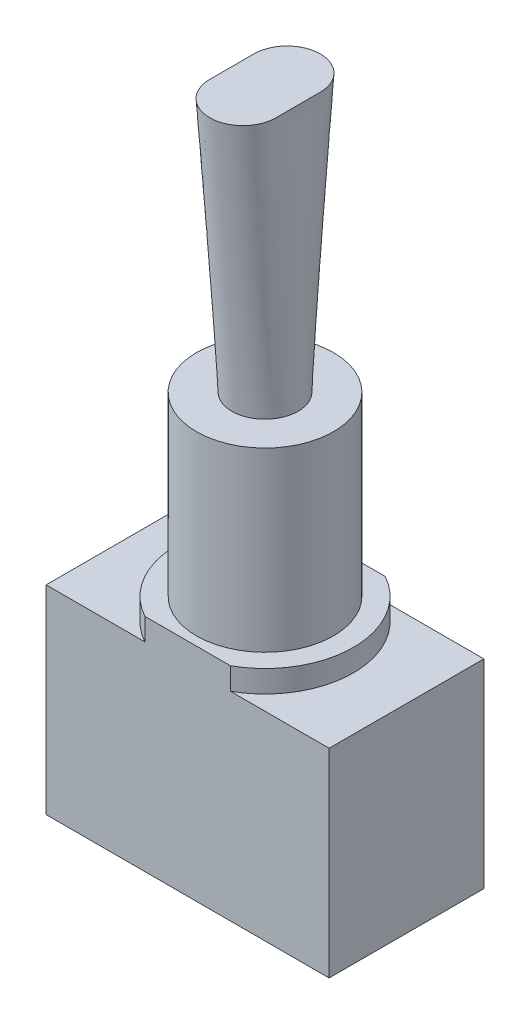
ISO-10303-21;
HEADER;
FILE_DESCRIPTION(('STEP AP214'),'2;1');
FILE_NAME('part.step','',(''),(''),'','','');
FILE_SCHEMA(('AUTOMOTIVE_DESIGN { 1 0 10303 214 1 1 1 1 }'));
ENDSEC;
DATA;
#1=APPLICATION_CONTEXT('core data for automotive mechanical design processes');
#2=APPLICATION_PROTOCOL_DEFINITION('international standard','automotive_design',2000,#1);
#3=PRODUCT_CONTEXT('',#1,'mechanical');
#4=PRODUCT('Part','Part','',(#3));
#5=PRODUCT_RELATED_PRODUCT_CATEGORY('part','',(#4));
#6=PRODUCT_DEFINITION_FORMATION('','',#4);
#7=PRODUCT_DEFINITION_CONTEXT('part definition',#1,'design');
#8=PRODUCT_DEFINITION('design','',#6,#7);
#9=PRODUCT_DEFINITION_SHAPE('','',#8);
#10=(LENGTH_UNIT() NAMED_UNIT(*) SI_UNIT(.MILLI.,.METRE.));
#11=(NAMED_UNIT(*) PLANE_ANGLE_UNIT() SI_UNIT($,.RADIAN.));
#12=(NAMED_UNIT(*) SI_UNIT($,.STERADIAN.) SOLID_ANGLE_UNIT());
#13=UNCERTAINTY_MEASURE_WITH_UNIT(LENGTH_MEASURE(1.E-05),#10,'distance_accuracy_value','');
#14=(GEOMETRIC_REPRESENTATION_CONTEXT(3) GLOBAL_UNCERTAINTY_ASSIGNED_CONTEXT((#13)) GLOBAL_UNIT_ASSIGNED_CONTEXT((#10,
#11,#12)) REPRESENTATION_CONTEXT('',''));
#15=CARTESIAN_POINT('',(0.,0.,0.));
#16=DIRECTION('',(0.,0.,1.));
#17=DIRECTION('',(1.,0.,0.));
#18=AXIS2_PLACEMENT_3D('',#15,#16,#17);
#19=CARTESIAN_POINT('',(0.,9.,0.));
#20=DIRECTION('',(0.,1.,0.));
#21=DIRECTION('',(-1.,0.,0.));
#22=AXIS2_PLACEMENT_3D('',#19,#20,#21);
#23=PLANE('',#22);
#24=CARTESIAN_POINT('',(0.,9.,0.));
#25=DIRECTION('',(0.,1.,0.));
#26=DIRECTION('',(-1.,0.,0.));
#27=AXIS2_PLACEMENT_3D('',#24,#25,#26);
#28=CIRCLE('',#27,3.1);
#29=CARTESIAN_POINT('',(-3.1,9.,0.));
#30=VERTEX_POINT('',#29);
#31=EDGE_CURVE('E277',#30,#30,#28,.T.);
#32=ORIENTED_EDGE('',*,*,#31,.T.);
#33=EDGE_LOOP('',(#32));
#34=FACE_BOUND('',#33,.T.);
#35=CARTESIAN_POINT('',(1.24807544149403,9.,0.832050294356937));
#36=CARTESIAN_POINT('',(1.20133692597067,9.,0.902160729367027));
#37=CARTESIAN_POINT('',(1.14864519037181,9.,0.968384128750064));
#38=CARTESIAN_POINT('',(1.03283818114837,9.,1.09107508511931));
#39=CARTESIAN_POINT('',(0.969711029555633,9.00000000000001,1.14753137321222));
#40=CARTESIAN_POINT('',(0.834903490052469,9.00000000000001,1.24904346207671));
#41=CARTESIAN_POINT('',(0.763226908495332,9.,1.29410430861978));
#42=CARTESIAN_POINT('',(0.613337555787563,9.,1.37150290649936));
#43=CARTESIAN_POINT('',(0.535126152537166,9.,1.40384331249024));
#44=CARTESIAN_POINT('',(0.374400746169665,9.,1.45493881534206));
#45=CARTESIAN_POINT('',(0.291889596443437,9.,1.47370280172707));
#46=CARTESIAN_POINT('',(0.166744289280897,9.,1.49129196919745));
#47=CARTESIAN_POINT('',(0.124790286990428,9.,1.49539530361572));
#48=CARTESIAN_POINT('',(0.0406452366346708,9.,1.50005670798287));
#49=CARTESIAN_POINT('',(-0.00154599872154061,9.,1.50061140710965));
#50=CARTESIAN_POINT('',(-0.127980786835977,9.,1.49691050063212));
#51=CARTESIAN_POINT('',(-0.212127790183483,9.,1.48729582160764));
#52=CARTESIAN_POINT('',(-0.377583812630178,9.,1.45412384754825));
#53=CARTESIAN_POINT('',(-0.458892747785838,9.,1.43056614048007));
#54=CARTESIAN_POINT('',(-0.616472641687582,9.,1.37009187486763));
#55=CARTESIAN_POINT('',(-0.692739446994487,9.,1.33316446130195));
#56=CARTESIAN_POINT('',(-0.83796941695162,9.,1.24700388449779));
#57=CARTESIAN_POINT('',(-0.906932612618931,9.,1.19777077352233));
#58=CARTESIAN_POINT('',(-1.03550604609819,9.,1.08852423505009));
#59=CARTESIAN_POINT('',(-1.0951312843772,9.,1.02852843641902));
#60=CARTESIAN_POINT('',(-1.2034654382807,9.,0.899328155393515));
#61=CARTESIAN_POINT('',(-1.25217456017744,9.,0.830123847043579));
#62=CARTESIAN_POINT('',(-1.31604012089631,9.,0.720999375547972));
#63=CARTESIAN_POINT('',(-1.33580934698477,9.,0.683702015038258));
#64=CARTESIAN_POINT('',(-1.37215694635964,9.,0.607576437861285));
#65=CARTESIAN_POINT('',(-1.38873580582673,9.,0.56874845553413));
#66=CARTESIAN_POINT('',(-1.41849809557213,9.,0.489813902627563));
#67=CARTESIAN_POINT('',(-1.43168153089496,9.,0.449707333947825));
#68=CARTESIAN_POINT('',(-1.45459298076124,9.,0.368512151892581));
#69=CARTESIAN_POINT('',(-1.46432024036621,9.,0.327423326050256));
#70=CARTESIAN_POINT('',(-1.48036298961169,9.,0.244655073042447));
#71=CARTESIAN_POINT('',(-1.4866838467136,9.,0.202976681845821));
#72=CARTESIAN_POINT('',(-1.49585927104291,9.,0.119245942644533));
#73=CARTESIAN_POINT('',(-1.49871473848357,9.,0.0771936946181463));
#74=CARTESIAN_POINT('',(-1.50074010612782,9.,-0.00700313567536265));
#75=CARTESIAN_POINT('',(-1.49990989004445,9.,-0.0491477208138798));
#76=CARTESIAN_POINT('',(-1.49466735402359,9.,-0.13321831956026));
#77=CARTESIAN_POINT('',(-1.4902541413625,9.,-0.175144276075208));
#78=CARTESIAN_POINT('',(-1.47800939340328,9.,-0.258485442896494));
#79=CARTESIAN_POINT('',(-1.47017860765903,9.,-0.299900763150469));
#80=CARTESIAN_POINT('',(-1.45112892829137,9.,-0.381929449194439));
#81=CARTESIAN_POINT('',(-1.43991069390128,9.,-0.422542969386262));
#82=CARTESIAN_POINT('',(-1.40106365586316,9.,-0.542700301816977));
#83=CARTESIAN_POINT('',(-1.36823313505446,9.,-0.620626834692001));
#84=CARTESIAN_POINT('',(-1.28998152022767,9.,-0.770083031247473));
#85=CARTESIAN_POINT('',(-1.2445262088556,9.,-0.841594601344945));
#86=CARTESIAN_POINT('',(-1.14221792998618,9.,-0.975969240953625));
#87=CARTESIAN_POINT('',(-1.08536458251806,9.,-1.03883202202653));
#88=CARTESIAN_POINT('',(-0.961914364377287,9.,-1.15408526658517));
#89=CARTESIAN_POINT('',(-0.895319513918329,9.,-1.20647789607569));
#90=CARTESIAN_POINT('',(-0.754274755311886,9.,-1.29933548634434));
#91=CARTESIAN_POINT('',(-0.679825012696657,9.,-1.33980069841007));
#92=CARTESIAN_POINT('',(-0.525293178668607,9.,-1.40755401442247));
#93=CARTESIAN_POINT('',(-0.445219933244354,9.,-1.43486230536477));
#94=CARTESIAN_POINT('',(-0.281634537583299,9.,-1.47570553520588));
#95=CARTESIAN_POINT('',(-0.198122347182574,9.,-1.48924031319439));
#96=CARTESIAN_POINT('',(-0.0298690635333674,9.,-1.50208908846101));
#97=CARTESIAN_POINT('',(0.0548738175122375,9.,-1.50137977189421));
#98=CARTESIAN_POINT('',(0.223029336967559,9.,-1.48571614170893));
#99=CARTESIAN_POINT('',(0.306441955708861,9.,-1.47076161766802));
#100=CARTESIAN_POINT('',(0.469464074093446,9.,-1.42712026057117));
#101=CARTESIAN_POINT('',(0.549078994344112,9.,-1.3984536860881));
#102=CARTESIAN_POINT('',(0.702346073679166,9.,-1.32812892546914));
#103=CARTESIAN_POINT('',(0.775998395735342,9.,-1.28647109456584));
#104=CARTESIAN_POINT('',(0.915261177158498,9.,-1.19140718978174));
#105=CARTESIAN_POINT('',(0.980873430040036,9.,-1.13800374347516));
#106=CARTESIAN_POINT('',(1.10219734247297,9.,-1.02094507350223));
#107=CARTESIAN_POINT('',(1.15790873721337,9.,-0.957289575718561));
#108=CARTESIAN_POINT('',(1.25789073980004,9.,-0.821464639105362));
#109=CARTESIAN_POINT('',(1.30215673390321,9.,-0.749291783873949));
#110=CARTESIAN_POINT('',(1.35903818788136,9.,-0.636342936267508));
#111=CARTESIAN_POINT('',(1.37641801851118,9.,-0.59789360478877));
#112=CARTESIAN_POINT('',(1.4078479217168,9.,-0.5196462090255));
#113=CARTESIAN_POINT('',(1.4218982822076,9.,-0.479848261702581));
#114=CARTESIAN_POINT('',(1.44648167671764,9.,-0.399335959315842));
#115=CARTESIAN_POINT('',(1.4570266568816,9.,-0.358625232104804));
#116=CARTESIAN_POINT('',(1.47474833031725,9.,-0.276473550692696));
#117=CARTESIAN_POINT('',(1.48192451729829,9.,-0.235032487700993));
#118=CARTESIAN_POINT('',(1.4928596068804,9.,-0.151683966116935));
#119=CARTESIAN_POINT('',(1.49661732120384,9.,-0.109776350468556));
#120=CARTESIAN_POINT('',(1.50051503816023,9.,-0.0257984534834264));
#121=CARTESIAN_POINT('',(1.50065583079876,9.,0.0162717903243723));
#122=CARTESIAN_POINT('',(1.49729782160614,9.,0.100405313830783));
#123=CARTESIAN_POINT('',(1.49378676648549,9.,0.142468093368881));
#124=CARTESIAN_POINT('',(1.48331291814883,9.,0.226169849183093));
#125=CARTESIAN_POINT('',(1.47634911204522,9.,0.267808697435926));
#126=CARTESIAN_POINT('',(1.45903460349268,9.,0.350333550971707));
#127=CARTESIAN_POINT('',(1.44868757429843,9.,0.391220322176683));
#128=CARTESIAN_POINT('',(1.42453415804447,9.,0.471938021997213));
#129=CARTESIAN_POINT('',(1.4107293218106,9.,0.511769415117578));
#130=CARTESIAN_POINT('',(1.37578373303054,9.,0.600216580635534));
#131=CARTESIAN_POINT('',(1.35366928694751,9.,0.648451057743666));
#132=CARTESIAN_POINT('',(1.30451346748017,9.,0.742319721202348));
#133=CARTESIAN_POINT('',(1.27747196283498,9.,0.787953838234643));
#134=CARTESIAN_POINT('',(1.24807544149403,9.,0.832050294356937));
#135=B_SPLINE_CURVE_WITH_KNOTS('',3,(#35,#36,#37,#38,#39,#40,#41,#42,#43,#44,#45,#46,#47,#48,
#49,#50,#51,#52,#53,#54,#55,#56,#57,#58,#59,#60,#61,#62,#63,#64,#65,#66,#67,#68,#69,#70,#71,#72,
#73,#74,#75,#76,#77,#78,#79,#80,#81,#82,#83,#84,#85,#86,#87,#88,#89,#90,#91,#92,#93,#94,#95,#96,
#97,#98,#99,#100,#101,#102,#103,#104,#105,#106,#107,#108,#109,#110,#111,#112,#113,#114,#115,
#116,#117,#118,#119,#120,#121,#122,#123,#124,#125,#126,#127,#128,#129,#130,#131,#132,#133,#134),
.UNSPECIFIED.,.T.,.F.,(4,2,2,2,2,2,2,2,2,2,2,2,2,2,2,2,2,2,2,2,2,2,2,2,2,2,2,2,2,2,2,2,2,2,2,2,
2,2,2,2,2,2,2,2,2,2,2,2,2,4),(0.,0.252599874100037,0.505489271652423,0.758266495827001,
1.01099093938838,1.26354975473423,1.38988330609759,1.51633684296007,1.76911722194476,
2.02190507126691,2.27489862396285,2.52789110219871,2.78047291061199,3.03304994580654,
3.15956787569353,3.2860665101897,3.41256495674783,3.53909101761994,3.66541712435522,
3.79171040800121,3.91800767635371,4.04433642203585,4.17063747477539,4.29691396381874,
4.549269756869,4.80231630657177,5.0553712933671,5.30837387528401,5.56137112654516,
5.81397895167473,6.06658972788386,6.31961399529385,6.5726420002983,6.82529732380603,
7.0779457393183,7.33053769304077,7.58313640163861,7.83583677683493,7.96229935687723,
8.08875099710976,8.21476717021902,8.34080227604261,8.46688117555737,8.59293253677023,
8.71940821523413,8.84592101815619,8.97229691637023,9.09861623618935,9.25748648827045,
9.41636097340446),.UNSPECIFIED.);
#136=CARTESIAN_POINT('',(1.24807544149403,9.,0.832050294356937));
#137=VERTEX_POINT('',#136);
#138=EDGE_CURVE('E117',#137,#137,#135,.F.);
#139=ORIENTED_EDGE('',*,*,#138,.F.);
#140=EDGE_LOOP('',(#139));
#141=FACE_BOUND('',#140,.T.);
#142=ADVANCED_FACE('F113',(#34,#141),#23,.T.);
#143=CARTESIAN_POINT('',(-6.4,0.,3.5));
#144=DIRECTION('',(0.,-1.,0.));
#145=DIRECTION('',(1.,0.,0.));
#146=AXIS2_PLACEMENT_3D('',#143,#144,#145);
#147=PLANE('',#146);
#148=CARTESIAN_POINT('',(0.,0.,0.));
#149=DIRECTION('',(0.,1.,0.));
#150=DIRECTION('',(-1.,0.,0.));
#151=AXIS2_PLACEMENT_3D('',#148,#149,#150);
#152=CIRCLE('',#151,4.);
#153=CARTESIAN_POINT('',(1.93649167310371,0.,3.5));
#154=VERTEX_POINT('',#153);
#155=CARTESIAN_POINT('',(1.93649167310371,0.,-3.5));
#156=VERTEX_POINT('',#155);
#157=EDGE_CURVE('E135',#154,#156,#152,.T.);
#158=ORIENTED_EDGE('',*,*,#157,.F.);
#159=DIRECTION('',(-1.,0.,0.));
#160=VECTOR('',#159,1.);
#161=CARTESIAN_POINT('',(-6.4,0.,3.5));
#162=LINE('',#161,#160);
#163=CARTESIAN_POINT('',(6.4,0.,3.5));
#164=VERTEX_POINT('',#163);
#165=EDGE_CURVE('E318',#164,#154,#162,.T.);
#166=ORIENTED_EDGE('',*,*,#165,.F.);
#167=DIRECTION('',(0.,0.,-1.));
#168=VECTOR('',#167,1.);
#169=CARTESIAN_POINT('',(6.4,0.,3.5));
#170=LINE('',#169,#168);
#171=CARTESIAN_POINT('',(6.4,0.,-3.5));
#172=VERTEX_POINT('',#171);
#173=EDGE_CURVE('E331',#164,#172,#170,.T.);
#174=ORIENTED_EDGE('',*,*,#173,.T.);
#175=DIRECTION('',(-1.,0.,0.));
#176=VECTOR('',#175,1.);
#177=CARTESIAN_POINT('',(-6.4,0.,-3.5));
#178=LINE('',#177,#176);
#179=EDGE_CURVE('E313',#172,#156,#178,.T.);
#180=ORIENTED_EDGE('',*,*,#179,.T.);
#181=EDGE_LOOP('',(#158,#166,#174,#180));
#182=FACE_BOUND('',#181,.T.);
#183=ADVANCED_FACE('F354',(#182),#147,.F.);
#184=CARTESIAN_POINT('',(-6.4,0.,3.5));
#185=DIRECTION('',(1.,0.,0.));
#186=DIRECTION('',(0.,1.,0.));
#187=AXIS2_PLACEMENT_3D('',#184,#185,#186);
#188=PLANE('',#187);
#189=DIRECTION('',(0.,-1.,0.));
#190=VECTOR('',#189,1.);
#191=CARTESIAN_POINT('',(-6.4,0.,-3.5));
#192=LINE('',#191,#190);
#193=CARTESIAN_POINT('',(-6.4,0.,-3.5));
#194=VERTEX_POINT('',#193);
#195=CARTESIAN_POINT('',(-6.4,-9.,-3.5));
#196=VERTEX_POINT('',#195);
#197=EDGE_CURVE('E308',#194,#196,#192,.T.);
#198=ORIENTED_EDGE('',*,*,#197,.T.);
#199=DIRECTION('',(0.,0.,-1.));
#200=VECTOR('',#199,1.);
#201=CARTESIAN_POINT('',(-6.4,-9.,3.5));
#202=LINE('',#201,#200);
#203=CARTESIAN_POINT('',(-6.4,-9.,3.5));
#204=VERTEX_POINT('',#203);
#205=EDGE_CURVE('E127',#204,#196,#202,.T.);
#206=ORIENTED_EDGE('',*,*,#205,.F.);
#207=DIRECTION('',(0.,-1.,0.));
#208=VECTOR('',#207,1.);
#209=CARTESIAN_POINT('',(-6.4,0.,3.5));
#210=LINE('',#209,#208);
#211=CARTESIAN_POINT('',(-6.4,0.,3.5));
#212=VERTEX_POINT('',#211);
#213=EDGE_CURVE('E309',#212,#204,#210,.T.);
#214=ORIENTED_EDGE('',*,*,#213,.F.);
#215=DIRECTION('',(0.,0.,-1.));
#216=VECTOR('',#215,1.);
#217=CARTESIAN_POINT('',(-6.4,0.,3.5));
#218=LINE('',#217,#216);
#219=EDGE_CURVE('E320',#212,#194,#218,.T.);
#220=ORIENTED_EDGE('',*,*,#219,.T.);
#221=EDGE_LOOP('',(#198,#206,#214,#220));
#222=FACE_BOUND('',#221,.T.);
#223=ADVANCED_FACE('F115',(#222),#188,.F.);
#224=CARTESIAN_POINT('',(-6.4,-9.,3.5));
#225=DIRECTION('',(0.,1.,0.));
#226=DIRECTION('',(-1.,0.,0.));
#227=AXIS2_PLACEMENT_3D('',#224,#225,#226);
#228=PLANE('',#227);
#229=DIRECTION('',(1.,0.,0.));
#230=VECTOR('',#229,1.);
#231=CARTESIAN_POINT('',(-6.4,-9.,-3.5));
#232=LINE('',#231,#230);
#233=CARTESIAN_POINT('',(6.4,-9.,-3.5));
#234=VERTEX_POINT('',#233);
#235=EDGE_CURVE('E323',#196,#234,#232,.T.);
#236=ORIENTED_EDGE('',*,*,#235,.T.);
#237=DIRECTION('',(0.,0.,-1.));
#238=VECTOR('',#237,1.);
#239=CARTESIAN_POINT('',(6.4,-9.,3.5));
#240=LINE('',#239,#238);
#241=CARTESIAN_POINT('',(6.4,-9.,3.5));
#242=VERTEX_POINT('',#241);
#243=EDGE_CURVE('E334',#242,#234,#240,.T.);
#244=ORIENTED_EDGE('',*,*,#243,.F.);
#245=DIRECTION('',(1.,0.,0.));
#246=VECTOR('',#245,1.);
#247=CARTESIAN_POINT('',(-6.4,-9.,3.5));
#248=LINE('',#247,#246);
#249=EDGE_CURVE('E312',#204,#242,#248,.T.);
#250=ORIENTED_EDGE('',*,*,#249,.F.);
#251=ORIENTED_EDGE('',*,*,#205,.T.);
#252=EDGE_LOOP('',(#236,#244,#250,#251));
#253=FACE_BOUND('',#252,.T.);
#254=ADVANCED_FACE('F339',(#253),#228,.F.);
#255=CARTESIAN_POINT('',(6.4,0.,3.5));
#256=DIRECTION('',(-1.,0.,0.));
#257=DIRECTION('',(0.,0.,1.));
#258=AXIS2_PLACEMENT_3D('',#255,#256,#257);
#259=PLANE('',#258);
#260=DIRECTION('',(0.,1.,0.));
#261=VECTOR('',#260,1.);
#262=CARTESIAN_POINT('',(6.4,0.,-3.5));
#263=LINE('',#262,#261);
#264=EDGE_CURVE('E325',#234,#172,#263,.T.);
#265=ORIENTED_EDGE('',*,*,#264,.T.);
#266=ORIENTED_EDGE('',*,*,#173,.F.);
#267=DIRECTION('',(0.,1.,0.));
#268=VECTOR('',#267,1.);
#269=CARTESIAN_POINT('',(6.4,0.,3.5));
#270=LINE('',#269,#268);
#271=EDGE_CURVE('E315',#242,#164,#270,.T.);
#272=ORIENTED_EDGE('',*,*,#271,.F.);
#273=ORIENTED_EDGE('',*,*,#243,.T.);
#274=EDGE_LOOP('',(#265,#266,#272,#273));
#275=FACE_BOUND('',#274,.T.);
#276=ADVANCED_FACE('F352',(#275),#259,.F.);
#277=CARTESIAN_POINT('',(0.,0.,0.));
#278=DIRECTION('',(0.,1.,0.));
#279=DIRECTION('',(-1.,0.,0.));
#280=AXIS2_PLACEMENT_3D('',#277,#278,#279);
#281=CIRCLE('',#280,4.);
#282=CARTESIAN_POINT('',(-1.93649167310371,0.,-3.5));
#283=VERTEX_POINT('',#282);
#284=CARTESIAN_POINT('',(-1.93649167310371,0.,3.5));
#285=VERTEX_POINT('',#284);
#286=EDGE_CURVE('E143',#283,#285,#281,.T.);
#287=ORIENTED_EDGE('',*,*,#286,.F.);
#288=EDGE_CURVE('E327',#283,#194,#178,.T.);
#289=ORIENTED_EDGE('',*,*,#288,.T.);
#290=ORIENTED_EDGE('',*,*,#219,.F.);
#291=EDGE_CURVE('E317',#285,#212,#162,.T.);
#292=ORIENTED_EDGE('',*,*,#291,.F.);
#293=EDGE_LOOP('',(#287,#289,#290,#292));
#294=FACE_BOUND('',#293,.T.);
#295=ADVANCED_FACE('F385',(#294),#147,.F.);
#296=CARTESIAN_POINT('',(0.,0.,3.5));
#297=DIRECTION('',(0.,0.,1.));
#298=DIRECTION('',(1.,0.,0.));
#299=AXIS2_PLACEMENT_3D('',#296,#297,#298);
#300=PLANE('',#299);
#301=ORIENTED_EDGE('',*,*,#213,.T.);
#302=ORIENTED_EDGE('',*,*,#249,.T.);
#303=ORIENTED_EDGE('',*,*,#271,.T.);
#304=ORIENTED_EDGE('',*,*,#165,.T.);
#305=DIRECTION('',(0.,-1.,0.));
#306=VECTOR('',#305,1.);
#307=CARTESIAN_POINT('',(1.93649167310371,1.,3.5));
#308=LINE('',#307,#306);
#309=CARTESIAN_POINT('',(1.93649167310371,1.,3.5));
#310=VERTEX_POINT('',#309);
#311=EDGE_CURVE('E294',#310,#154,#308,.T.);
#312=ORIENTED_EDGE('',*,*,#311,.F.);
#313=DIRECTION('',(1.,0.,0.));
#314=VECTOR('',#313,1.);
#315=CARTESIAN_POINT('',(1.93649167310371,1.,3.5));
#316=LINE('',#315,#314);
#317=CARTESIAN_POINT('',(-1.93649167310371,1.,3.5));
#318=VERTEX_POINT('',#317);
#319=EDGE_CURVE('E292',#318,#310,#316,.T.);
#320=ORIENTED_EDGE('',*,*,#319,.F.);
#321=DIRECTION('',(0.,-1.,0.));
#322=VECTOR('',#321,1.);
#323=CARTESIAN_POINT('',(-1.93649167310371,1.,3.5));
#324=LINE('',#323,#322);
#325=EDGE_CURVE('E299',#318,#285,#324,.T.);
#326=ORIENTED_EDGE('',*,*,#325,.T.);
#327=ORIENTED_EDGE('',*,*,#291,.T.);
#328=EDGE_LOOP('',(#301,#302,#303,#304,#312,#320,#326,#327));
#329=FACE_BOUND('',#328,.T.);
#330=ADVANCED_FACE('F357',(#329),#300,.T.);
#331=CARTESIAN_POINT('',(0.,0.,-3.5));
#332=DIRECTION('',(0.,0.,1.));
#333=DIRECTION('',(1.,0.,0.));
#334=AXIS2_PLACEMENT_3D('',#331,#332,#333);
#335=PLANE('',#334);
#336=ORIENTED_EDGE('',*,*,#197,.F.);
#337=ORIENTED_EDGE('',*,*,#288,.F.);
#338=DIRECTION('',(0.,-1.,0.));
#339=VECTOR('',#338,1.);
#340=CARTESIAN_POINT('',(-1.93649167310371,1.,-3.5));
#341=LINE('',#340,#339);
#342=CARTESIAN_POINT('',(-1.93649167310371,1.,-3.5));
#343=VERTEX_POINT('',#342);
#344=EDGE_CURVE('E302',#343,#283,#341,.T.);
#345=ORIENTED_EDGE('',*,*,#344,.F.);
#346=DIRECTION('',(-1.,0.,0.));
#347=VECTOR('',#346,1.);
#348=CARTESIAN_POINT('',(1.93649167310371,1.,-3.5));
#349=LINE('',#348,#347);
#350=CARTESIAN_POINT('',(1.93649167310371,1.,-3.5));
#351=VERTEX_POINT('',#350);
#352=EDGE_CURVE('E288',#351,#343,#349,.T.);
#353=ORIENTED_EDGE('',*,*,#352,.F.);
#354=DIRECTION('',(0.,-1.,0.));
#355=VECTOR('',#354,1.);
#356=CARTESIAN_POINT('',(1.93649167310371,1.,-3.5));
#357=LINE('',#356,#355);
#358=EDGE_CURVE('E305',#351,#156,#357,.T.);
#359=ORIENTED_EDGE('',*,*,#358,.T.);
#360=ORIENTED_EDGE('',*,*,#179,.F.);
#361=ORIENTED_EDGE('',*,*,#264,.F.);
#362=ORIENTED_EDGE('',*,*,#235,.F.);
#363=EDGE_LOOP('',(#336,#337,#345,#353,#359,#360,#361,#362));
#364=FACE_BOUND('',#363,.T.);
#365=ADVANCED_FACE('F346',(#364),#335,.F.);
#366=CARTESIAN_POINT('',(0.,1.,0.));
#367=DIRECTION('',(0.,-1.,0.));
#368=DIRECTION('',(1.,0.,0.));
#369=AXIS2_PLACEMENT_3D('',#366,#367,#368);
#370=CYLINDRICAL_SURFACE('',#369,4.);
#371=ORIENTED_EDGE('',*,*,#157,.T.);
#372=ORIENTED_EDGE('',*,*,#358,.F.);
#373=CARTESIAN_POINT('',(0.,1.,0.));
#374=DIRECTION('',(0.,1.,0.));
#375=DIRECTION('',(-1.,0.,0.));
#376=AXIS2_PLACEMENT_3D('',#373,#374,#375);
#377=CIRCLE('',#376,4.);
#378=EDGE_CURVE('E285',#310,#351,#377,.T.);
#379=ORIENTED_EDGE('',*,*,#378,.F.);
#380=ORIENTED_EDGE('',*,*,#311,.T.);
#381=EDGE_LOOP('',(#371,#372,#379,#380));
#382=FACE_BOUND('',#381,.T.);
#383=ADVANCED_FACE('F361',(#382),#370,.T.);
#384=CARTESIAN_POINT('',(0.,1.,0.));
#385=DIRECTION('',(0.,-1.,0.));
#386=DIRECTION('',(1.,0.,0.));
#387=AXIS2_PLACEMENT_3D('',#384,#385,#386);
#388=CYLINDRICAL_SURFACE('',#387,4.);
#389=ORIENTED_EDGE('',*,*,#286,.T.);
#390=ORIENTED_EDGE('',*,*,#325,.F.);
#391=CARTESIAN_POINT('',(0.,1.,0.));
#392=DIRECTION('',(0.,1.,0.));
#393=DIRECTION('',(-1.,0.,0.));
#394=AXIS2_PLACEMENT_3D('',#391,#392,#393);
#395=CIRCLE('',#394,4.);
#396=EDGE_CURVE('E290',#343,#318,#395,.T.);
#397=ORIENTED_EDGE('',*,*,#396,.F.);
#398=ORIENTED_EDGE('',*,*,#344,.T.);
#399=EDGE_LOOP('',(#389,#390,#397,#398));
#400=FACE_BOUND('',#399,.T.);
#401=ADVANCED_FACE('F368',(#400),#388,.T.);
#402=CARTESIAN_POINT('',(0.,1.,0.));
#403=DIRECTION('',(0.,1.,0.));
#404=DIRECTION('',(-1.,0.,0.));
#405=AXIS2_PLACEMENT_3D('',#402,#403,#404);
#406=PLANE('',#405);
#407=CARTESIAN_POINT('',(0.,1.,0.));
#408=DIRECTION('',(0.,1.,0.));
#409=DIRECTION('',(-1.,0.,0.));
#410=AXIS2_PLACEMENT_3D('',#407,#408,#409);
#411=CIRCLE('',#410,3.1);
#412=CARTESIAN_POINT('',(-3.1,0.999999999999999,0.));
#413=VERTEX_POINT('',#412);
#414=EDGE_CURVE('E12',#413,#413,#411,.T.);
#415=ORIENTED_EDGE('',*,*,#414,.F.);
#416=EDGE_LOOP('',(#415));
#417=FACE_BOUND('',#416,.T.);
#418=ORIENTED_EDGE('',*,*,#378,.T.);
#419=ORIENTED_EDGE('',*,*,#352,.T.);
#420=ORIENTED_EDGE('',*,*,#396,.T.);
#421=ORIENTED_EDGE('',*,*,#319,.T.);
#422=EDGE_LOOP('',(#418,#419,#420,#421));
#423=FACE_BOUND('',#422,.T.);
#424=ADVANCED_FACE('F364',(#417,#423),#406,.T.);
#425=CARTESIAN_POINT('',(0.,9.,0.));
#426=DIRECTION('',(0.,-1.,0.));
#427=DIRECTION('',(1.,0.,0.));
#428=AXIS2_PLACEMENT_3D('',#425,#426,#427);
#429=CYLINDRICAL_SURFACE('',#428,3.1);
#430=ORIENTED_EDGE('',*,*,#31,.F.);
#431=EDGE_LOOP('',(#430));
#432=FACE_BOUND('',#431,.T.);
#433=ORIENTED_EDGE('',*,*,#414,.T.);
#434=EDGE_LOOP('',(#433));
#435=FACE_BOUND('',#434,.T.);
#436=ADVANCED_FACE('F375',(#432,#435),#429,.T.);
#437=CARTESIAN_POINT('',(0.,21.,-1.));
#438=DIRECTION('',(0.,1.,0.));
#439=DIRECTION('',(-1.,0.,0.));
#440=AXIS2_PLACEMENT_3D('',#437,#438,#439);
#441=PLANE('',#440);
#442=CARTESIAN_POINT('',(0.,21.,-1.));
#443=DIRECTION('',(0.,1.,0.));
#444=DIRECTION('',(-1.,0.,0.));
#445=AXIS2_PLACEMENT_3D('',#442,#443,#444);
#446=CIRCLE('',#445,1.5);
#447=CARTESIAN_POINT('',(1.5,21.,-1.));
#448=VERTEX_POINT('',#447);
#449=CARTESIAN_POINT('',(-1.5,21.,-1.00000000005842));
#450=VERTEX_POINT('',#449);
#451=EDGE_CURVE('E203',#448,#450,#446,.T.);
#452=ORIENTED_EDGE('',*,*,#451,.T.);
#453=DIRECTION('',(0.,0.,1.));
#454=VECTOR('',#453,1.);
#455=CARTESIAN_POINT('',(-1.5,21.,-0.999999999999999));
#456=LINE('',#455,#454);
#457=CARTESIAN_POINT('',(-1.5,21.,0.999999999999902));
#458=VERTEX_POINT('',#457);
#459=EDGE_CURVE('E215',#450,#458,#456,.T.);
#460=ORIENTED_EDGE('',*,*,#459,.T.);
#461=CARTESIAN_POINT('',(0.,21.,1.));
#462=DIRECTION('',(0.,1.,0.));
#463=DIRECTION('',(-1.,0.,0.));
#464=AXIS2_PLACEMENT_3D('',#461,#462,#463);
#465=CIRCLE('',#464,1.5);
#466=CARTESIAN_POINT('',(1.5,21.,1.));
#467=VERTEX_POINT('',#466);
#468=EDGE_CURVE('E205',#458,#467,#465,.T.);
#469=ORIENTED_EDGE('',*,*,#468,.T.);
#470=DIRECTION('',(0.,0.,-1.));
#471=VECTOR('',#470,1.);
#472=CARTESIAN_POINT('',(1.5,21.,-1.));
#473=LINE('',#472,#471);
#474=EDGE_CURVE('E198',#467,#448,#473,.T.);
#475=ORIENTED_EDGE('',*,*,#474,.T.);
#476=EDGE_LOOP('',(#452,#460,#469,#475));
#477=FACE_BOUND('',#476,.T.);
#478=ADVANCED_FACE('F201',(#477),#441,.T.);
#479=CARTESIAN_POINT('',(-1.5,21.,-0.999999999254511));
#480=CARTESIAN_POINT('',(-1.24807544149404,9.,-0.832050294356937));
#481=CARTESIAN_POINT('',(-1.5,21.,-1.18566878982843));
#482=CARTESIAN_POINT('',(-1.17577162164189,9.,-0.94050602413516));
#483=CARTESIAN_POINT('',(-1.43019091178448,21.,-1.56454994067664));
#484=CARTESIAN_POINT('',(-1.00671087744486,9.,-1.13307137365744));
#485=CARTESIAN_POINT('',(-1.10888099883276,21.,-2.06828558091636));
#486=CARTESIAN_POINT('',(-0.699452784641455,9.,-1.34380864040262));
#487=CARTESIAN_POINT('',(-0.606403503532656,21.,-2.41684861593363));
#488=CARTESIAN_POINT('',(-0.358220052224194,9.,-1.47136272228835));
#489=CARTESIAN_POINT('',(0.,21.,-2.54169934872158));
#490=CARTESIAN_POINT('',(0.,9.,-1.51434396701635));
#491=CARTESIAN_POINT('',(0.606403503532648,21.,-2.41684861593363));
#492=CARTESIAN_POINT('',(0.358220052224189,9.,-1.47136272228835));
#493=CARTESIAN_POINT('',(1.10888099883276,21.,-2.06828558091636));
#494=CARTESIAN_POINT('',(0.699452784641451,9.,-1.34380864040262));
#495=CARTESIAN_POINT('',(1.43019091178447,21.,-1.56454994067665));
#496=CARTESIAN_POINT('',(1.00671087744485,9.,-1.13307137365744));
#497=CARTESIAN_POINT('',(1.5,21.,-1.18566878982843));
#498=CARTESIAN_POINT('',(1.17577162164189,9.,-0.940506024135161));
#499=CARTESIAN_POINT('',(1.5,21.,-0.811971834254722));
#500=CARTESIAN_POINT('',(1.32129805756888,9.,-0.722216370244671));
#501=CARTESIAN_POINT('',(1.5,21.,-0.473320268384262));
#502=CARTESIAN_POINT('',(1.44933965808405,8.99999999999999,-0.467018971784361));
#503=CARTESIAN_POINT('',(1.49999999999999,21.,0.));
#504=CARTESIAN_POINT('',(1.52556330628483,9.00000000000001,0.));
#505=CARTESIAN_POINT('',(1.5,21.,0.473320268384261));
#506=CARTESIAN_POINT('',(1.44933965808405,9.,0.467018971784361));
#507=CARTESIAN_POINT('',(1.5,21.,0.81197183425472));
#508=CARTESIAN_POINT('',(1.32129805756888,9.,0.72221637024467));
#509=CARTESIAN_POINT('',(1.5,21.,1.18566878982843));
#510=CARTESIAN_POINT('',(1.17577162164189,9.,0.940506024135161));
#511=CARTESIAN_POINT('',(1.43019091178447,21.,1.56454994067664));
#512=CARTESIAN_POINT('',(1.00671087744485,9.,1.13307137365744));
#513=CARTESIAN_POINT('',(1.10888099883276,21.,2.06828558091636));
#514=CARTESIAN_POINT('',(0.699452784641451,9.00000000000001,1.34380864040262));
#515=CARTESIAN_POINT('',(0.606403503532647,21.,2.41684861593362));
#516=CARTESIAN_POINT('',(0.35822005222419,9.,1.47136272228835));
#517=CARTESIAN_POINT('',(0.,21.,2.54169934872158));
#518=CARTESIAN_POINT('',(0.,9.,1.51434396701635));
#519=CARTESIAN_POINT('',(-0.606403503532657,21.,2.41684861593363));
#520=CARTESIAN_POINT('',(-0.358220052224193,9.,1.47136272228835));
#521=CARTESIAN_POINT('',(-1.10888099883276,21.,2.06828558091636));
#522=CARTESIAN_POINT('',(-0.699452784641454,9.,1.34380864040262));
#523=CARTESIAN_POINT('',(-1.43019091178448,21.,1.56454994067665));
#524=CARTESIAN_POINT('',(-1.00671087744485,9.,1.13307137365744));
#525=CARTESIAN_POINT('',(-1.5,21.,1.18566878982843));
#526=CARTESIAN_POINT('',(-1.17577162164189,9.,0.940506024135161));
#527=CARTESIAN_POINT('',(-1.5,21.,0.811971834254721));
#528=CARTESIAN_POINT('',(-1.32129805756888,9.,0.722216370244671));
#529=CARTESIAN_POINT('',(-1.50000000000001,21.,0.473320268384262));
#530=CARTESIAN_POINT('',(-1.44933965808406,9.00000000000001,0.467018971784362));
#531=CARTESIAN_POINT('',(-1.5,21.,0.));
#532=CARTESIAN_POINT('',(-1.52556330628483,8.99999999999999,0.));
#533=CARTESIAN_POINT('',(-1.50000000000001,21.,-0.473320268384262));
#534=CARTESIAN_POINT('',(-1.44933965808406,9.00000000000001,-0.46701897178436));
#535=CARTESIAN_POINT('',(-1.5,21.,-0.81197183425472));
#536=CARTESIAN_POINT('',(-1.32129805756888,9.,-0.72221637024467));
#537=CARTESIAN_POINT('',(-1.5,21.,-0.999999999254511));
#538=CARTESIAN_POINT('',(-1.24807544149404,9.,-0.832050294356937));
#539=B_SPLINE_SURFACE_WITH_KNOTS('',3,1,((#479,#480),(#481,#482),(#483,#484),(#485,#486),(#487,
#488),(#489,#490),(#491,#492),(#493,#494),(#495,#496),(#497,#498),(#499,#500),(#501,#502),(#503,
#504),(#505,#506),(#507,#508),(#509,#510),(#511,#512),(#513,#514),(#515,#516),(#517,#518),(#519,
#520),(#521,#522),(#523,#524),(#525,#526),(#527,#528),(#529,#530),(#531,#532),(#533,#534),(#535,
#536),(#537,#538)),.UNSPECIFIED.,.T.,.F.,.F.,(4,1,1,1,1,1,1,1,2,1,1,1,2,1,1,1,1,1,1,1,2,1,1,1,
4),(2,2),(0.,0.0414909189230453,0.0829818378460906,0.124472756769136,0.165963675692181,
0.207454594615226,0.248945513538272,0.290436432461317,0.331927351384362,0.373945513538272,
0.415963675692181,0.457981837846091,0.5,0.541490918923045,0.582981837846091,0.624472756769136,
0.665963675692181,0.707454594615227,0.748945513538272,0.790436432461317,0.831927351384362,
0.873945513538272,0.915963675692181,0.957981837846091,1.),(0.,1.),.UNSPECIFIED.);
#540=ORIENTED_EDGE('',*,*,#468,.F.);
#541=ORIENTED_EDGE('',*,*,#459,.F.);
#542=ORIENTED_EDGE('',*,*,#451,.F.);
#543=ORIENTED_EDGE('',*,*,#474,.F.);
#544=EDGE_LOOP('',(#540,#541,#542,#543));
#545=FACE_BOUND('',#544,.T.);
#546=ORIENTED_EDGE('',*,*,#138,.T.);
#547=EDGE_LOOP('',(#546));
#548=FACE_BOUND('',#547,.T.);
#549=ADVANCED_FACE('F213',(#545,#548),#539,.T.);
#550=CLOSED_SHELL('',(#142,#183,#223,#254,#276,#295,#330,#365,#383,#401,#424,#436,#478,#549));
#551=MANIFOLD_SOLID_BREP('B2',#550);
#552=ADVANCED_BREP_SHAPE_REPRESENTATION('',(#18,#551),#14);
#553=SHAPE_DEFINITION_REPRESENTATION(#9,#552);
ENDSEC;
END-ISO-10303-21;
